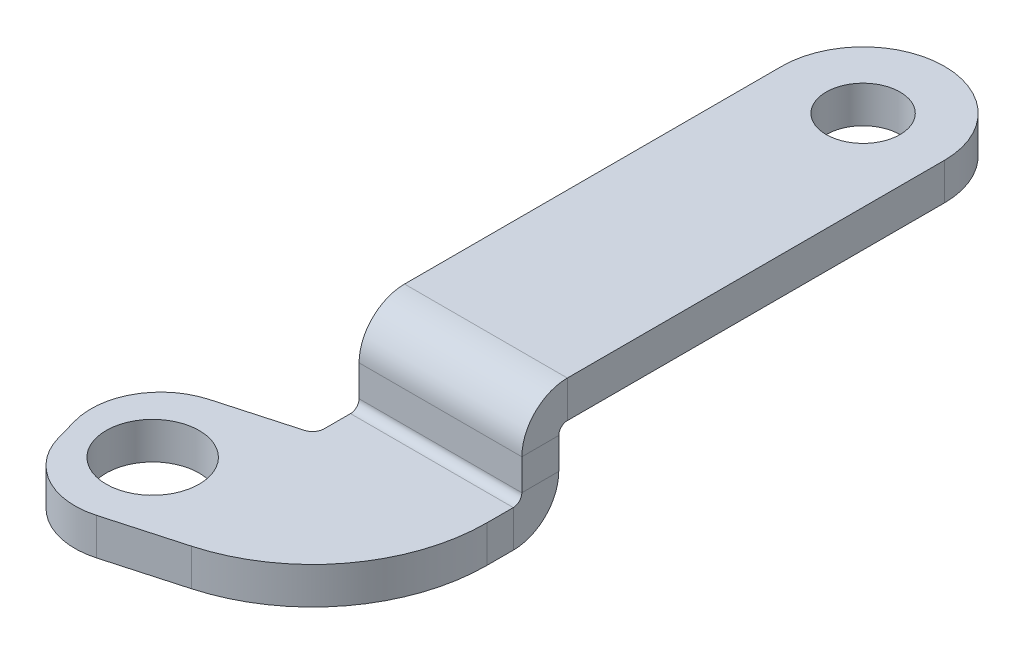
ISO-10303-21;
HEADER;
FILE_DESCRIPTION(('STEP AP214'),'2;1');
FILE_NAME('part.step','',(''),(''),'','','');
FILE_SCHEMA(('AUTOMOTIVE_DESIGN { 1 0 10303 214 1 1 1 1 }'));
ENDSEC;
DATA;
#1=APPLICATION_CONTEXT('core data for automotive mechanical design processes');
#2=APPLICATION_PROTOCOL_DEFINITION('international standard','automotive_design',2000,#1);
#3=PRODUCT_CONTEXT('',#1,'mechanical');
#4=PRODUCT('Part','Part','',(#3));
#5=PRODUCT_RELATED_PRODUCT_CATEGORY('part','',(#4));
#6=PRODUCT_DEFINITION_FORMATION('','',#4);
#7=PRODUCT_DEFINITION_CONTEXT('part definition',#1,'design');
#8=PRODUCT_DEFINITION('design','',#6,#7);
#9=PRODUCT_DEFINITION_SHAPE('','',#8);
#10=(LENGTH_UNIT() NAMED_UNIT(*) SI_UNIT(.MILLI.,.METRE.));
#11=(NAMED_UNIT(*) PLANE_ANGLE_UNIT() SI_UNIT($,.RADIAN.));
#12=(NAMED_UNIT(*) SI_UNIT($,.STERADIAN.) SOLID_ANGLE_UNIT());
#13=UNCERTAINTY_MEASURE_WITH_UNIT(LENGTH_MEASURE(1.E-05),#10,'distance_accuracy_value','');
#14=(GEOMETRIC_REPRESENTATION_CONTEXT(3) GLOBAL_UNCERTAINTY_ASSIGNED_CONTEXT((#13)) GLOBAL_UNIT_ASSIGNED_CONTEXT((#10,
#11,#12)) REPRESENTATION_CONTEXT('',''));
#15=CARTESIAN_POINT('',(0.,0.,0.));
#16=DIRECTION('',(0.,0.,1.));
#17=DIRECTION('',(1.,0.,0.));
#18=AXIS2_PLACEMENT_3D('',#15,#16,#17);
#19=CARTESIAN_POINT('',(0.,7.32499481379612,0.));
#20=DIRECTION('',(0.,-1.,0.));
#21=DIRECTION('',(0.,0.,-1.));
#22=AXIS2_PLACEMENT_3D('',#19,#20,#21);
#23=PLANE('',#22);
#24=DIRECTION('',(0.,0.,-1.));
#25=VECTOR('',#24,1.);
#26=CARTESIAN_POINT('',(19.2500013183316,7.32499481379612,0.));
#27=LINE('',#26,#25);
#28=CARTESIAN_POINT('',(19.2500013183316,7.32499481379612,-16.4116));
#29=VERTEX_POINT('',#28);
#30=CARTESIAN_POINT('',(19.2500013183316,7.32499481379612,-48.8499986312992));
#31=VERTEX_POINT('',#30);
#32=EDGE_CURVE('E261',#29,#31,#27,.T.);
#33=ORIENTED_EDGE('',*,*,#32,.T.);
#34=CARTESIAN_POINT('',(12.2500013183316,7.32499481379612,-48.8499986312992));
#35=DIRECTION('',(0.,1.,0.));
#36=DIRECTION('',(0.,0.,1.));
#37=AXIS2_PLACEMENT_3D('',#34,#35,#36);
#38=CIRCLE('',#37,7.00000000000002);
#39=CARTESIAN_POINT('',(5.25000131833154,7.32499481379612,-48.8499986312992));
#40=VERTEX_POINT('',#39);
#41=EDGE_CURVE('E244',#40,#31,#38,.F.);
#42=ORIENTED_EDGE('',*,*,#41,.F.);
#43=DIRECTION('',(0.,0.,1.));
#44=VECTOR('',#43,1.);
#45=CARTESIAN_POINT('',(5.25000131833154,7.32499481379612,0.));
#46=LINE('',#45,#44);
#47=CARTESIAN_POINT('',(5.25000131833154,7.32499481379612,-16.4116));
#48=VERTEX_POINT('',#47);
#49=EDGE_CURVE('E259',#40,#48,#46,.T.);
#50=ORIENTED_EDGE('',*,*,#49,.T.);
#51=DIRECTION('',(1.,0.,0.));
#52=VECTOR('',#51,1.);
#53=CARTESIAN_POINT('',(5.25000131833154,7.32499481379612,-16.4116));
#54=LINE('',#53,#52);
#55=EDGE_CURVE('E263',#29,#48,#54,.F.);
#56=ORIENTED_EDGE('',*,*,#55,.F.);
#57=EDGE_LOOP('',(#33,#42,#50,#56));
#58=FACE_BOUND('',#57,.T.);
#59=CARTESIAN_POINT('',(12.2500013183316,7.32499481379612,-48.8499986312992));
#60=DIRECTION('',(0.,1.,0.));
#61=DIRECTION('',(0.,0.,1.));
#62=AXIS2_PLACEMENT_3D('',#59,#60,#61);
#63=CIRCLE('',#62,3.175);
#64=CARTESIAN_POINT('',(12.2500013183316,7.32499481379612,-45.6749986312992));
#65=VERTEX_POINT('',#64);
#66=EDGE_CURVE('E794',#65,#65,#63,.T.);
#67=ORIENTED_EDGE('',*,*,#66,.F.);
#68=EDGE_LOOP('',(#67));
#69=FACE_BOUND('',#68,.T.);
#70=ADVANCED_FACE('F105',(#58,#69),#23,.F.);
#71=CARTESIAN_POINT('',(0.,4.14999481379613,0.));
#72=DIRECTION('',(0.,-1.,0.));
#73=DIRECTION('',(0.,0.,-1.));
#74=AXIS2_PLACEMENT_3D('',#71,#72,#73);
#75=PLANE('',#74);
#76=CARTESIAN_POINT('',(12.2500013183316,4.14999481379612,-48.8499986312992));
#77=DIRECTION('',(0.,1.,0.));
#78=DIRECTION('',(0.,0.,1.));
#79=AXIS2_PLACEMENT_3D('',#76,#77,#78);
#80=CIRCLE('',#79,7.00000000000002);
#81=CARTESIAN_POINT('',(5.25000131833154,4.14999481379612,-48.8499986312992));
#82=VERTEX_POINT('',#81);
#83=CARTESIAN_POINT('',(19.2500013183316,4.14999481379612,-48.8499986312992));
#84=VERTEX_POINT('',#83);
#85=EDGE_CURVE('E233',#82,#84,#80,.F.);
#86=ORIENTED_EDGE('',*,*,#85,.T.);
#87=DIRECTION('',(0.,0.,1.));
#88=VECTOR('',#87,1.);
#89=CARTESIAN_POINT('',(19.2500013183316,4.14999481379612,-55.8499986312992));
#90=LINE('',#89,#88);
#91=CARTESIAN_POINT('',(19.2500013183316,4.14999481379612,-16.4116));
#92=VERTEX_POINT('',#91);
#93=EDGE_CURVE('E239',#92,#84,#90,.F.);
#94=ORIENTED_EDGE('',*,*,#93,.F.);
#95=DIRECTION('',(1.,0.,0.));
#96=VECTOR('',#95,1.);
#97=CARTESIAN_POINT('',(5.25000131833154,4.14999481379612,-16.4116));
#98=LINE('',#97,#96);
#99=CARTESIAN_POINT('',(5.25000131833154,4.14999481379612,-16.4116));
#100=VERTEX_POINT('',#99);
#101=EDGE_CURVE('E269',#100,#92,#98,.T.);
#102=ORIENTED_EDGE('',*,*,#101,.F.);
#103=DIRECTION('',(0.,0.,-1.));
#104=VECTOR('',#103,1.);
#105=CARTESIAN_POINT('',(5.25000131833154,4.14999481379612,-15.675));
#106=LINE('',#105,#104);
#107=EDGE_CURVE('E240',#82,#100,#106,.F.);
#108=ORIENTED_EDGE('',*,*,#107,.F.);
#109=EDGE_LOOP('',(#86,#94,#102,#108));
#110=FACE_BOUND('',#109,.T.);
#111=CARTESIAN_POINT('',(12.2500013183316,4.14999481379612,-48.8499986312992));
#112=DIRECTION('',(0.,1.,0.));
#113=DIRECTION('',(0.,0.,1.));
#114=AXIS2_PLACEMENT_3D('',#111,#112,#113);
#115=CIRCLE('',#114,3.175);
#116=CARTESIAN_POINT('',(12.2500013183316,4.14999481379612,-45.6749986312992));
#117=VERTEX_POINT('',#116);
#118=EDGE_CURVE('E253',#117,#117,#115,.T.);
#119=ORIENTED_EDGE('',*,*,#118,.T.);
#120=EDGE_LOOP('',(#119));
#121=FACE_BOUND('',#120,.T.);
#122=ADVANCED_FACE('F235',(#110,#121),#75,.T.);
#123=CARTESIAN_POINT('',(19.2500013183316,7.32499481379612,-55.8499986312992));
#124=DIRECTION('',(-1.,0.,0.));
#125=DIRECTION('',(0.,0.,1.));
#126=AXIS2_PLACEMENT_3D('',#123,#124,#125);
#127=PLANE('',#126);
#128=DIRECTION('',(0.,1.,0.));
#129=VECTOR('',#128,1.);
#130=CARTESIAN_POINT('',(19.2500013183316,4.14999481379612,-48.8499986312992));
#131=LINE('',#130,#129);
#132=EDGE_CURVE('E247',#84,#31,#131,.T.);
#133=ORIENTED_EDGE('',*,*,#132,.T.);
#134=ORIENTED_EDGE('',*,*,#32,.F.);
#135=DIRECTION('',(0.,-1.,0.));
#136=VECTOR('',#135,1.);
#137=CARTESIAN_POINT('',(19.2500013183316,4.14999481379612,-16.4116));
#138=LINE('',#137,#136);
#139=EDGE_CURVE('E258',#92,#29,#138,.F.);
#140=ORIENTED_EDGE('',*,*,#139,.F.);
#141=ORIENTED_EDGE('',*,*,#93,.T.);
#142=EDGE_LOOP('',(#133,#134,#140,#141));
#143=FACE_BOUND('',#142,.T.);
#144=ADVANCED_FACE('F256',(#143),#127,.F.);
#145=CARTESIAN_POINT('',(19.2500013183316,0.,-15.675));
#146=DIRECTION('',(-1.,0.,0.));
#147=DIRECTION('',(0.,0.,1.));
#148=AXIS2_PLACEMENT_3D('',#145,#146,#147);
#149=PLANE('',#148);
#150=DIRECTION('',(0.,0.,1.));
#151=VECTOR('',#150,1.);
#152=CARTESIAN_POINT('',(19.2500013183316,3.41339481379613,-15.675));
#153=LINE('',#152,#151);
#154=CARTESIAN_POINT('',(19.2500013183316,3.41339481379613,-15.675));
#155=VERTEX_POINT('',#154);
#156=CARTESIAN_POINT('',(19.2500013183316,3.41339481379614,-12.5));
#157=VERTEX_POINT('',#156);
#158=EDGE_CURVE('E279',#155,#157,#153,.T.);
#159=ORIENTED_EDGE('',*,*,#158,.T.);
#160=DIRECTION('',(0.,-1.,0.));
#161=VECTOR('',#160,1.);
#162=CARTESIAN_POINT('',(19.2500013183316,0.,-12.5));
#163=LINE('',#162,#161);
#164=CARTESIAN_POINT('',(19.2500013183316,0.736599999999989,-12.5));
#165=VERTEX_POINT('',#164);
#166=EDGE_CURVE('E305',#157,#165,#163,.T.);
#167=ORIENTED_EDGE('',*,*,#166,.T.);
#168=DIRECTION('',(0.,0.,-1.));
#169=VECTOR('',#168,1.);
#170=CARTESIAN_POINT('',(19.2500013183316,0.736599999999997,-12.5));
#171=LINE('',#170,#169);
#172=CARTESIAN_POINT('',(19.2500013183316,0.736599999999978,-15.675));
#173=VERTEX_POINT('',#172);
#174=EDGE_CURVE('E292',#165,#173,#171,.T.);
#175=ORIENTED_EDGE('',*,*,#174,.T.);
#176=DIRECTION('',(0.,-1.,0.));
#177=VECTOR('',#176,1.);
#178=CARTESIAN_POINT('',(19.2500013183316,0.,-15.675));
#179=LINE('',#178,#177);
#180=EDGE_CURVE('E306',#155,#173,#179,.T.);
#181=ORIENTED_EDGE('',*,*,#180,.F.);
#182=EDGE_LOOP('',(#159,#167,#175,#181));
#183=FACE_BOUND('',#182,.T.);
#184=ADVANCED_FACE('F437',(#183),#149,.F.);
#185=CARTESIAN_POINT('',(5.25000131833154,7.32499481379612,-15.675));
#186=DIRECTION('',(1.,0.,0.));
#187=DIRECTION('',(0.,1.,0.));
#188=AXIS2_PLACEMENT_3D('',#185,#186,#187);
#189=PLANE('',#188);
#190=DIRECTION('',(0.,0.,1.));
#191=VECTOR('',#190,1.);
#192=CARTESIAN_POINT('',(5.25000131833154,3.41339481379613,-15.675));
#193=LINE('',#192,#191);
#194=CARTESIAN_POINT('',(5.25000131833154,3.41339481379613,-15.675));
#195=VERTEX_POINT('',#194);
#196=CARTESIAN_POINT('',(5.25000131833154,3.41339481379613,-12.5));
#197=VERTEX_POINT('',#196);
#198=EDGE_CURVE('E290',#195,#197,#193,.T.);
#199=ORIENTED_EDGE('',*,*,#198,.F.);
#200=DIRECTION('',(0.,1.,0.));
#201=VECTOR('',#200,1.);
#202=CARTESIAN_POINT('',(5.25000131833154,7.32499481379612,-15.675));
#203=LINE('',#202,#201);
#204=CARTESIAN_POINT('',(5.25000131833154,0.736600000000019,-15.675));
#205=VERTEX_POINT('',#204);
#206=EDGE_CURVE('E308',#205,#195,#203,.T.);
#207=ORIENTED_EDGE('',*,*,#206,.F.);
#208=DIRECTION('',(0.,0.,-1.));
#209=VECTOR('',#208,1.);
#210=CARTESIAN_POINT('',(5.25000131833154,0.736599999999997,-12.5));
#211=LINE('',#210,#209);
#212=CARTESIAN_POINT('',(5.25000131833154,0.736599999999989,-12.5));
#213=VERTEX_POINT('',#212);
#214=EDGE_CURVE('E297',#213,#205,#211,.T.);
#215=ORIENTED_EDGE('',*,*,#214,.F.);
#216=DIRECTION('',(0.,1.,0.));
#217=VECTOR('',#216,1.);
#218=CARTESIAN_POINT('',(5.25000131833154,7.32499481379613,-12.5));
#219=LINE('',#218,#217);
#220=EDGE_CURVE('E309',#213,#197,#219,.T.);
#221=ORIENTED_EDGE('',*,*,#220,.T.);
#222=EDGE_LOOP('',(#199,#207,#215,#221));
#223=FACE_BOUND('',#222,.T.);
#224=ADVANCED_FACE('F450',(#223),#189,.F.);
#225=CARTESIAN_POINT('',(0.,0.,-15.675));
#226=DIRECTION('',(0.,0.,1.));
#227=DIRECTION('',(0.,-1.,0.));
#228=AXIS2_PLACEMENT_3D('',#225,#226,#227);
#229=PLANE('',#228);
#230=DIRECTION('',(1.,0.,0.));
#231=VECTOR('',#230,1.);
#232=CARTESIAN_POINT('',(19.2500013183316,3.41339481379613,-15.675));
#233=LINE('',#232,#231);
#234=EDGE_CURVE('E285',#155,#195,#233,.F.);
#235=ORIENTED_EDGE('',*,*,#234,.F.);
#236=ORIENTED_EDGE('',*,*,#180,.T.);
#237=DIRECTION('',(1.,0.,0.));
#238=VECTOR('',#237,1.);
#239=CARTESIAN_POINT('',(0.,0.736600000000019,-15.675));
#240=LINE('',#239,#238);
#241=EDGE_CURVE('E300',#205,#173,#240,.T.);
#242=ORIENTED_EDGE('',*,*,#241,.F.);
#243=ORIENTED_EDGE('',*,*,#206,.T.);
#244=EDGE_LOOP('',(#235,#236,#242,#243));
#245=FACE_BOUND('',#244,.T.);
#246=ADVANCED_FACE('F453',(#245),#229,.F.);
#247=CARTESIAN_POINT('',(0.,0.,-12.5));
#248=DIRECTION('',(0.,0.,1.));
#249=DIRECTION('',(0.,-1.,0.));
#250=AXIS2_PLACEMENT_3D('',#247,#248,#249);
#251=PLANE('',#250);
#252=ORIENTED_EDGE('',*,*,#166,.F.);
#253=DIRECTION('',(1.,0.,0.));
#254=VECTOR('',#253,1.);
#255=CARTESIAN_POINT('',(19.2500013183316,3.41339481379614,-12.5));
#256=LINE('',#255,#254);
#257=EDGE_CURVE('E274',#157,#197,#256,.F.);
#258=ORIENTED_EDGE('',*,*,#257,.T.);
#259=ORIENTED_EDGE('',*,*,#220,.F.);
#260=DIRECTION('',(-1.,0.,0.));
#261=VECTOR('',#260,1.);
#262=CARTESIAN_POINT('',(19.2500013183316,0.736599999999997,-12.5));
#263=LINE('',#262,#261);
#264=EDGE_CURVE('E295',#165,#213,#263,.T.);
#265=ORIENTED_EDGE('',*,*,#264,.F.);
#266=EDGE_LOOP('',(#252,#258,#259,#265));
#267=FACE_BOUND('',#266,.T.);
#268=ADVANCED_FACE('F440',(#267),#251,.T.);
#269=CARTESIAN_POINT('',(5.25000131833154,-3.175,-9.5));
#270=DIRECTION('',(-1.,0.,0.));
#271=DIRECTION('',(0.,0.,1.));
#272=AXIS2_PLACEMENT_3D('',#269,#270,#271);
#273=PLANE('',#272);
#274=DIRECTION('',(0.,0.,1.));
#275=VECTOR('',#274,1.);
#276=CARTESIAN_POINT('',(5.25000131833154,0.,-9.5));
#277=LINE('',#276,#275);
#278=CARTESIAN_POINT('',(5.25000131833154,0.,-11.7634));
#279=VERTEX_POINT('',#278);
#280=CARTESIAN_POINT('',(5.25000131833154,0.,-9.5));
#281=VERTEX_POINT('',#280);
#282=EDGE_CURVE('E380',#279,#281,#277,.T.);
#283=ORIENTED_EDGE('',*,*,#282,.F.);
#284=DIRECTION('',(0.,-1.,0.));
#285=VECTOR('',#284,1.);
#286=CARTESIAN_POINT('',(5.25000131833154,0.,-11.7634));
#287=LINE('',#286,#285);
#288=CARTESIAN_POINT('',(5.25000131833154,-3.17500000000001,-11.7634));
#289=VERTEX_POINT('',#288);
#290=EDGE_CURVE('E322',#279,#289,#287,.T.);
#291=ORIENTED_EDGE('',*,*,#290,.T.);
#292=DIRECTION('',(0.,0.,1.));
#293=VECTOR('',#292,1.);
#294=CARTESIAN_POINT('',(5.25000131833154,-3.175,-9.5));
#295=LINE('',#294,#293);
#296=CARTESIAN_POINT('',(5.25000131833154,-3.175,-9.5));
#297=VERTEX_POINT('',#296);
#298=EDGE_CURVE('E356',#289,#297,#295,.T.);
#299=ORIENTED_EDGE('',*,*,#298,.T.);
#300=DIRECTION('',(0.,1.,0.));
#301=VECTOR('',#300,1.);
#302=CARTESIAN_POINT('',(5.25000131833154,-3.175,-9.5));
#303=LINE('',#302,#301);
#304=EDGE_CURVE('E398',#297,#281,#303,.T.);
#305=ORIENTED_EDGE('',*,*,#304,.T.);
#306=EDGE_LOOP('',(#283,#291,#299,#305));
#307=FACE_BOUND('',#306,.T.);
#308=ADVANCED_FACE('F509',(#307),#273,.T.);
#309=CARTESIAN_POINT('',(0.26995265979346,-3.175,0.962873595790457));
#310=DIRECTION('',(0.,1.,0.));
#311=DIRECTION('',(0.,0.,1.));
#312=AXIS2_PLACEMENT_3D('',#309,#310,#311);
#313=PLANE('',#312);
#314=CARTESIAN_POINT('',(0.,-3.175,0.));
#315=DIRECTION('',(0.,1.,0.));
#316=DIRECTION('',(0.,0.,1.));
#317=AXIS2_PLACEMENT_3D('',#314,#315,#316);
#318=CIRCLE('',#317,4.);
#319=CARTESIAN_POINT('',(0.,-3.175,4.));
#320=VERTEX_POINT('',#319);
#321=EDGE_CURVE('E337',#320,#320,#318,.T.);
#322=ORIENTED_EDGE('',*,*,#321,.T.);
#323=EDGE_LOOP('',(#322));
#324=FACE_BOUND('',#323,.T.);
#325=DIRECTION('',(-1.,0.,0.));
#326=VECTOR('',#325,1.);
#327=CARTESIAN_POINT('',(5.25000131833154,-3.17500000000001,-11.7634));
#328=LINE('',#327,#326);
#329=CARTESIAN_POINT('',(19.2500013183316,-3.175,-11.7634));
#330=VERTEX_POINT('',#329);
#331=EDGE_CURVE('E316',#289,#330,#328,.F.);
#332=ORIENTED_EDGE('',*,*,#331,.T.);
#333=DIRECTION('',(0.,0.,-1.));
#334=VECTOR('',#333,1.);
#335=CARTESIAN_POINT('',(19.2500013183315,-3.175,-9.5));
#336=LINE('',#335,#334);
#337=CARTESIAN_POINT('',(19.2500013183315,-3.175,-9.5));
#338=VERTEX_POINT('',#337);
#339=EDGE_CURVE('E353',#338,#330,#336,.T.);
#340=ORIENTED_EDGE('',*,*,#339,.F.);
#341=CARTESIAN_POINT('',(4.25000131833154,-3.175,-9.5));
#342=DIRECTION('',(0.,1.,0.));
#343=DIRECTION('',(0.,0.,1.));
#344=AXIS2_PLACEMENT_3D('',#341,#342,#343);
#345=CIRCLE('',#344,15.);
#346=CARTESIAN_POINT('',(8.29929121523342,-3.175,4.9431039368568));
#347=VERTEX_POINT('',#346);
#348=EDGE_CURVE('E350',#347,#338,#345,.T.);
#349=ORIENTED_EDGE('',*,*,#348,.F.);
#350=DIRECTION('',(0.962873595790453,0.,-0.269952659793459));
#351=VECTOR('',#350,1.);
#352=CARTESIAN_POINT('',(1.88966861855421,-3.175,6.74011517053317));
#353=LINE('',#352,#351);
#354=CARTESIAN_POINT('',(1.88966861855421,-3.175,6.74011517053317));
#355=VERTEX_POINT('',#354);
#356=EDGE_CURVE('E346',#355,#347,#353,.T.);
#357=ORIENTED_EDGE('',*,*,#356,.F.);
#358=CARTESIAN_POINT('',(0.26995265979346,-3.175,0.962873595790457));
#359=DIRECTION('',(0.,1.,0.));
#360=DIRECTION('',(0.,0.,1.));
#361=AXIS2_PLACEMENT_3D('',#358,#359,#360);
#362=CIRCLE('',#361,6.);
#363=CARTESIAN_POINT('',(-5.50728891494926,-3.175,2.58258955455121));
#364=VERTEX_POINT('',#363);
#365=EDGE_CURVE('E343',#364,#355,#362,.T.);
#366=ORIENTED_EDGE('',*,*,#365,.F.);
#367=DIRECTION('',(0.269952659793459,0.,0.962873595790453));
#368=VECTOR('',#367,1.);
#369=CARTESIAN_POINT('',(-5.50728891494926,-3.175,2.58258955455121));
#370=LINE('',#369,#368);
#371=CARTESIAN_POINT('',(-6.04719423453618,-3.175,0.656842362970299));
#372=VERTEX_POINT('',#371);
#373=EDGE_CURVE('E367',#372,#364,#370,.T.);
#374=ORIENTED_EDGE('',*,*,#373,.F.);
#375=CARTESIAN_POINT('',(-0.26995265979346,-3.175,-0.962873595790456));
#376=DIRECTION('',(0.,1.,0.));
#377=DIRECTION('',(0.,0.,-1.));
#378=AXIS2_PLACEMENT_3D('',#375,#376,#377);
#379=CIRCLE('',#378,6.);
#380=CARTESIAN_POINT('',(-1.88966861855421,-3.175,-6.74011517053317));
#381=VERTEX_POINT('',#380);
#382=EDGE_CURVE('E364',#381,#372,#379,.T.);
#383=ORIENTED_EDGE('',*,*,#382,.F.);
#384=DIRECTION('',(-0.962873595790453,0.,0.26995265979346));
#385=VECTOR('',#384,1.);
#386=CARTESIAN_POINT('',(-1.88966861855421,-3.175,-6.74011517053317));
#387=LINE('',#386,#385);
#388=CARTESIAN_POINT('',(4.519953978125,-3.175,-8.53712640420955));
#389=VERTEX_POINT('',#388);
#390=EDGE_CURVE('E361',#389,#381,#387,.T.);
#391=ORIENTED_EDGE('',*,*,#390,.F.);
#392=CARTESIAN_POINT('',(4.25000131833154,-3.175,-9.5));
#393=DIRECTION('',(0.,-1.,0.));
#394=DIRECTION('',(0.,0.,1.));
#395=AXIS2_PLACEMENT_3D('',#392,#393,#394);
#396=CIRCLE('',#395,1.);
#397=EDGE_CURVE('E358',#297,#389,#396,.T.);
#398=ORIENTED_EDGE('',*,*,#397,.F.);
#399=ORIENTED_EDGE('',*,*,#298,.F.);
#400=EDGE_LOOP('',(#332,#340,#349,#357,#366,#374,#383,#391,#398,#399));
#401=FACE_BOUND('',#400,.T.);
#402=ADVANCED_FACE('F418',(#324,#401),#313,.F.);
#403=CARTESIAN_POINT('',(0.26995265979346,0.,0.962873595790457));
#404=DIRECTION('',(0.,1.,0.));
#405=DIRECTION('',(0.,0.,1.));
#406=AXIS2_PLACEMENT_3D('',#403,#404,#405);
#407=PLANE('',#406);
#408=CARTESIAN_POINT('',(0.,0.,0.));
#409=DIRECTION('',(0.,1.,0.));
#410=DIRECTION('',(0.,0.,1.));
#411=AXIS2_PLACEMENT_3D('',#408,#409,#410);
#412=CIRCLE('',#411,4.);
#413=CARTESIAN_POINT('',(0.,0.,4.));
#414=VERTEX_POINT('',#413);
#415=EDGE_CURVE('E334',#414,#414,#412,.T.);
#416=ORIENTED_EDGE('',*,*,#415,.F.);
#417=EDGE_LOOP('',(#416));
#418=FACE_BOUND('',#417,.T.);
#419=DIRECTION('',(0.,0.,-1.));
#420=VECTOR('',#419,1.);
#421=CARTESIAN_POINT('',(19.2500013183315,0.,-9.5));
#422=LINE('',#421,#420);
#423=CARTESIAN_POINT('',(19.2500013183315,0.,-9.5));
#424=VERTEX_POINT('',#423);
#425=CARTESIAN_POINT('',(19.2500013183316,0.,-11.7634));
#426=VERTEX_POINT('',#425);
#427=EDGE_CURVE('E378',#424,#426,#422,.T.);
#428=ORIENTED_EDGE('',*,*,#427,.T.);
#429=DIRECTION('',(-1.,0.,0.));
#430=VECTOR('',#429,1.);
#431=CARTESIAN_POINT('',(5.25000131833154,0.,-11.7634));
#432=LINE('',#431,#430);
#433=EDGE_CURVE('E130',#279,#426,#432,.F.);
#434=ORIENTED_EDGE('',*,*,#433,.F.);
#435=ORIENTED_EDGE('',*,*,#282,.T.);
#436=CARTESIAN_POINT('',(4.25000131833154,0.,-9.5));
#437=DIRECTION('',(0.,-1.,0.));
#438=DIRECTION('',(0.,0.,1.));
#439=AXIS2_PLACEMENT_3D('',#436,#437,#438);
#440=CIRCLE('',#439,1.);
#441=CARTESIAN_POINT('',(4.519953978125,0.,-8.53712640420955));
#442=VERTEX_POINT('',#441);
#443=EDGE_CURVE('E382',#281,#442,#440,.T.);
#444=ORIENTED_EDGE('',*,*,#443,.T.);
#445=DIRECTION('',(-0.962873595790453,0.,0.26995265979346));
#446=VECTOR('',#445,1.);
#447=CARTESIAN_POINT('',(-1.88966861855421,0.,-6.74011517053317));
#448=LINE('',#447,#446);
#449=CARTESIAN_POINT('',(-1.88966861855421,0.,-6.74011517053317));
#450=VERTEX_POINT('',#449);
#451=EDGE_CURVE('E385',#442,#450,#448,.T.);
#452=ORIENTED_EDGE('',*,*,#451,.T.);
#453=CARTESIAN_POINT('',(-0.26995265979346,0.,-0.962873595790456));
#454=DIRECTION('',(0.,1.,0.));
#455=DIRECTION('',(0.,0.,-1.));
#456=AXIS2_PLACEMENT_3D('',#453,#454,#455);
#457=CIRCLE('',#456,6.);
#458=CARTESIAN_POINT('',(-6.04719423453618,0.,0.656842362970299));
#459=VERTEX_POINT('',#458);
#460=EDGE_CURVE('E388',#450,#459,#457,.T.);
#461=ORIENTED_EDGE('',*,*,#460,.T.);
#462=DIRECTION('',(0.269952659793459,0.,0.962873595790453));
#463=VECTOR('',#462,1.);
#464=CARTESIAN_POINT('',(-5.50728891494926,0.,2.58258955455121));
#465=LINE('',#464,#463);
#466=CARTESIAN_POINT('',(-5.50728891494926,0.,2.58258955455121));
#467=VERTEX_POINT('',#466);
#468=EDGE_CURVE('E347',#459,#467,#465,.T.);
#469=ORIENTED_EDGE('',*,*,#468,.T.);
#470=CARTESIAN_POINT('',(0.26995265979346,0.,0.962873595790457));
#471=DIRECTION('',(0.,1.,0.));
#472=DIRECTION('',(0.,0.,1.));
#473=AXIS2_PLACEMENT_3D('',#470,#471,#472);
#474=CIRCLE('',#473,6.);
#475=CARTESIAN_POINT('',(1.88966861855421,0.,6.74011517053317));
#476=VERTEX_POINT('',#475);
#477=EDGE_CURVE('E340',#467,#476,#474,.T.);
#478=ORIENTED_EDGE('',*,*,#477,.T.);
#479=DIRECTION('',(0.962873595790453,0.,-0.269952659793459));
#480=VECTOR('',#479,1.);
#481=CARTESIAN_POINT('',(1.88966861855421,0.,6.74011517053317));
#482=LINE('',#481,#480);
#483=CARTESIAN_POINT('',(8.29929121523342,0.,4.9431039368568));
#484=VERTEX_POINT('',#483);
#485=EDGE_CURVE('E372',#476,#484,#482,.T.);
#486=ORIENTED_EDGE('',*,*,#485,.T.);
#487=CARTESIAN_POINT('',(4.25000131833154,0.,-9.5));
#488=DIRECTION('',(0.,1.,0.));
#489=DIRECTION('',(0.,0.,1.));
#490=AXIS2_PLACEMENT_3D('',#487,#488,#489);
#491=CIRCLE('',#490,15.);
#492=EDGE_CURVE('E375',#484,#424,#491,.T.);
#493=ORIENTED_EDGE('',*,*,#492,.T.);
#494=EDGE_LOOP('',(#428,#434,#435,#444,#452,#461,#469,#478,#486,#493));
#495=FACE_BOUND('',#494,.T.);
#496=ADVANCED_FACE('F411',(#418,#495),#407,.T.);
#497=CARTESIAN_POINT('',(0.26995265979346,-3.175,0.962873595790457));
#498=DIRECTION('',(0.,1.,0.));
#499=DIRECTION('',(0.,0.,1.));
#500=AXIS2_PLACEMENT_3D('',#497,#498,#499);
#501=CYLINDRICAL_SURFACE('',#500,6.);
#502=ORIENTED_EDGE('',*,*,#477,.F.);
#503=DIRECTION('',(0.,1.,0.));
#504=VECTOR('',#503,1.);
#505=CARTESIAN_POINT('',(-5.50728891494926,-3.175,2.58258955455121));
#506=LINE('',#505,#504);
#507=EDGE_CURVE('E13',#364,#467,#506,.T.);
#508=ORIENTED_EDGE('',*,*,#507,.F.);
#509=ORIENTED_EDGE('',*,*,#365,.T.);
#510=DIRECTION('',(0.,1.,0.));
#511=VECTOR('',#510,1.);
#512=CARTESIAN_POINT('',(1.88966861855421,-3.175,6.74011517053317));
#513=LINE('',#512,#511);
#514=EDGE_CURVE('E109',#355,#476,#513,.T.);
#515=ORIENTED_EDGE('',*,*,#514,.T.);
#516=EDGE_LOOP('',(#502,#508,#509,#515));
#517=FACE_BOUND('',#516,.T.);
#518=ADVANCED_FACE('F107',(#517),#501,.T.);
#519=CARTESIAN_POINT('',(-5.50728891494926,-3.175,2.58258955455121));
#520=DIRECTION('',(-0.962873595790453,0.,0.269952659793459));
#521=DIRECTION('',(0.269952659793459,0.,0.962873595790453));
#522=AXIS2_PLACEMENT_3D('',#519,#520,#521);
#523=PLANE('',#522);
#524=ORIENTED_EDGE('',*,*,#468,.F.);
#525=DIRECTION('',(0.,1.,0.));
#526=VECTOR('',#525,1.);
#527=CARTESIAN_POINT('',(-6.04719423453618,-3.175,0.656842362970299));
#528=LINE('',#527,#526);
#529=EDGE_CURVE('E114',#372,#459,#528,.T.);
#530=ORIENTED_EDGE('',*,*,#529,.F.);
#531=ORIENTED_EDGE('',*,*,#373,.T.);
#532=ORIENTED_EDGE('',*,*,#507,.T.);
#533=EDGE_LOOP('',(#524,#530,#531,#532));
#534=FACE_BOUND('',#533,.T.);
#535=ADVANCED_FACE('F415',(#534),#523,.T.);
#536=CARTESIAN_POINT('',(-0.26995265979346,-3.175,-0.962873595790456));
#537=DIRECTION('',(0.,1.,0.));
#538=DIRECTION('',(0.,0.,1.));
#539=AXIS2_PLACEMENT_3D('',#536,#537,#538);
#540=CYLINDRICAL_SURFACE('',#539,6.);
#541=ORIENTED_EDGE('',*,*,#460,.F.);
#542=DIRECTION('',(0.,1.,0.));
#543=VECTOR('',#542,1.);
#544=CARTESIAN_POINT('',(-1.88966861855421,-3.175,-6.74011517053317));
#545=LINE('',#544,#543);
#546=EDGE_CURVE('E394',#381,#450,#545,.T.);
#547=ORIENTED_EDGE('',*,*,#546,.F.);
#548=ORIENTED_EDGE('',*,*,#382,.T.);
#549=ORIENTED_EDGE('',*,*,#529,.T.);
#550=EDGE_LOOP('',(#541,#547,#548,#549));
#551=FACE_BOUND('',#550,.T.);
#552=ADVANCED_FACE('F532',(#551),#540,.T.);
#553=CARTESIAN_POINT('',(-1.88966861855421,-3.175,-6.74011517053317));
#554=DIRECTION('',(-0.26995265979346,0.,-0.962873595790453));
#555=DIRECTION('',(-0.962873595790453,0.,0.26995265979346));
#556=AXIS2_PLACEMENT_3D('',#553,#554,#555);
#557=PLANE('',#556);
#558=ORIENTED_EDGE('',*,*,#451,.F.);
#559=DIRECTION('',(0.,1.,0.));
#560=VECTOR('',#559,1.);
#561=CARTESIAN_POINT('',(4.519953978125,-3.175,-8.53712640420955));
#562=LINE('',#561,#560);
#563=EDGE_CURVE('E396',#389,#442,#562,.T.);
#564=ORIENTED_EDGE('',*,*,#563,.F.);
#565=ORIENTED_EDGE('',*,*,#390,.T.);
#566=ORIENTED_EDGE('',*,*,#546,.T.);
#567=EDGE_LOOP('',(#558,#564,#565,#566));
#568=FACE_BOUND('',#567,.T.);
#569=ADVANCED_FACE('F469',(#568),#557,.T.);
#570=CARTESIAN_POINT('',(4.25000131833154,-3.175,-9.5));
#571=DIRECTION('',(0.,1.,0.));
#572=DIRECTION('',(0.,0.,1.));
#573=AXIS2_PLACEMENT_3D('',#570,#571,#572);
#574=CYLINDRICAL_SURFACE('',#573,1.);
#575=ORIENTED_EDGE('',*,*,#443,.F.);
#576=ORIENTED_EDGE('',*,*,#304,.F.);
#577=ORIENTED_EDGE('',*,*,#397,.T.);
#578=ORIENTED_EDGE('',*,*,#563,.T.);
#579=EDGE_LOOP('',(#575,#576,#577,#578));
#580=FACE_BOUND('',#579,.T.);
#581=ADVANCED_FACE('F460',(#580),#574,.F.);
#582=CARTESIAN_POINT('',(19.2500013183315,-3.175,-9.5));
#583=DIRECTION('',(1.,0.,0.));
#584=DIRECTION('',(0.,0.,-1.));
#585=AXIS2_PLACEMENT_3D('',#582,#583,#584);
#586=PLANE('',#585);
#587=DIRECTION('',(0.,-1.,0.));
#588=VECTOR('',#587,1.);
#589=CARTESIAN_POINT('',(19.2500013183316,0.,-11.7634));
#590=LINE('',#589,#588);
#591=EDGE_CURVE('E331',#426,#330,#590,.T.);
#592=ORIENTED_EDGE('',*,*,#591,.F.);
#593=ORIENTED_EDGE('',*,*,#427,.F.);
#594=DIRECTION('',(0.,1.,0.));
#595=VECTOR('',#594,1.);
#596=CARTESIAN_POINT('',(19.2500013183315,-3.175,-9.5));
#597=LINE('',#596,#595);
#598=EDGE_CURVE('E401',#338,#424,#597,.T.);
#599=ORIENTED_EDGE('',*,*,#598,.F.);
#600=ORIENTED_EDGE('',*,*,#339,.T.);
#601=EDGE_LOOP('',(#592,#593,#599,#600));
#602=FACE_BOUND('',#601,.T.);
#603=ADVANCED_FACE('F458',(#602),#586,.T.);
#604=CARTESIAN_POINT('',(4.25000131833154,-3.175,-9.5));
#605=DIRECTION('',(0.,1.,0.));
#606=DIRECTION('',(0.,0.,1.));
#607=AXIS2_PLACEMENT_3D('',#604,#605,#606);
#608=CYLINDRICAL_SURFACE('',#607,15.);
#609=ORIENTED_EDGE('',*,*,#492,.F.);
#610=DIRECTION('',(0.,1.,0.));
#611=VECTOR('',#610,1.);
#612=CARTESIAN_POINT('',(8.29929121523342,-3.175,4.9431039368568));
#613=LINE('',#612,#611);
#614=EDGE_CURVE('E402',#347,#484,#613,.T.);
#615=ORIENTED_EDGE('',*,*,#614,.F.);
#616=ORIENTED_EDGE('',*,*,#348,.T.);
#617=ORIENTED_EDGE('',*,*,#598,.T.);
#618=EDGE_LOOP('',(#609,#615,#616,#617));
#619=FACE_BOUND('',#618,.T.);
#620=ADVANCED_FACE('F423',(#619),#608,.T.);
#621=CARTESIAN_POINT('',(1.88966861855421,-3.175,6.74011517053317));
#622=DIRECTION('',(0.269952659793459,0.,0.962873595790453));
#623=DIRECTION('',(0.962873595790453,0.,-0.269952659793459));
#624=AXIS2_PLACEMENT_3D('',#621,#622,#623);
#625=PLANE('',#624);
#626=ORIENTED_EDGE('',*,*,#485,.F.);
#627=ORIENTED_EDGE('',*,*,#514,.F.);
#628=ORIENTED_EDGE('',*,*,#356,.T.);
#629=ORIENTED_EDGE('',*,*,#614,.T.);
#630=EDGE_LOOP('',(#626,#627,#628,#629));
#631=FACE_BOUND('',#630,.T.);
#632=ADVANCED_FACE('F410',(#631),#625,.T.);
#633=CARTESIAN_POINT('',(0.,-3.175,0.));
#634=DIRECTION('',(0.,1.,0.));
#635=DIRECTION('',(0.,0.,1.));
#636=AXIS2_PLACEMENT_3D('',#633,#634,#635);
#637=CYLINDRICAL_SURFACE('',#636,4.);
#638=ORIENTED_EDGE('',*,*,#321,.F.);
#639=EDGE_LOOP('',(#638));
#640=FACE_BOUND('',#639,.T.);
#641=ORIENTED_EDGE('',*,*,#415,.T.);
#642=EDGE_LOOP('',(#641));
#643=FACE_BOUND('',#642,.T.);
#644=ADVANCED_FACE('F519',(#640,#643),#637,.F.);
#645=CARTESIAN_POINT('',(19.2500013183316,0.736599999999992,-11.7634));
#646=DIRECTION('',(1.,0.,0.));
#647=DIRECTION('',(0.,0.,-1.));
#648=AXIS2_PLACEMENT_3D('',#645,#646,#647);
#649=PLANE('',#648);
#650=ORIENTED_EDGE('',*,*,#174,.F.);
#651=CARTESIAN_POINT('',(19.2500013183316,0.736599999999992,-11.7634));
#652=DIRECTION('',(-1.,0.,0.));
#653=DIRECTION('',(0.,0.,1.));
#654=AXIS2_PLACEMENT_3D('',#651,#652,#653);
#655=CIRCLE('',#654,0.7366);
#656=EDGE_CURVE('E325',#426,#165,#655,.F.);
#657=ORIENTED_EDGE('',*,*,#656,.F.);
#658=ORIENTED_EDGE('',*,*,#591,.T.);
#659=CARTESIAN_POINT('',(19.2500013183316,0.736599999999992,-11.7634));
#660=DIRECTION('',(-1.,0.,0.));
#661=DIRECTION('',(0.,0.,1.));
#662=AXIS2_PLACEMENT_3D('',#659,#660,#661);
#663=CIRCLE('',#662,3.9116);
#664=EDGE_CURVE('E318',#330,#173,#663,.F.);
#665=ORIENTED_EDGE('',*,*,#664,.T.);
#666=EDGE_LOOP('',(#650,#657,#658,#665));
#667=FACE_BOUND('',#666,.T.);
#668=ADVANCED_FACE('F433',(#667),#649,.T.);
#669=CARTESIAN_POINT('',(5.25000131833154,0.736599999999992,-11.7634));
#670=DIRECTION('',(1.,0.,0.));
#671=DIRECTION('',(0.,0.,-1.));
#672=AXIS2_PLACEMENT_3D('',#669,#670,#671);
#673=PLANE('',#672);
#674=CARTESIAN_POINT('',(5.25000131833154,0.736599999999992,-11.7634));
#675=DIRECTION('',(-1.,0.,0.));
#676=DIRECTION('',(0.,0.,1.));
#677=AXIS2_PLACEMENT_3D('',#674,#675,#676);
#678=CIRCLE('',#677,0.7366);
#679=EDGE_CURVE('E312',#213,#279,#678,.T.);
#680=ORIENTED_EDGE('',*,*,#679,.F.);
#681=ORIENTED_EDGE('',*,*,#214,.T.);
#682=CARTESIAN_POINT('',(5.25000131833154,0.736599999999992,-11.7634));
#683=DIRECTION('',(-1.,0.,0.));
#684=DIRECTION('',(0.,0.,1.));
#685=AXIS2_PLACEMENT_3D('',#682,#683,#684);
#686=CIRCLE('',#685,3.9116);
#687=EDGE_CURVE('E319',#205,#289,#686,.T.);
#688=ORIENTED_EDGE('',*,*,#687,.T.);
#689=ORIENTED_EDGE('',*,*,#290,.F.);
#690=EDGE_LOOP('',(#680,#681,#688,#689));
#691=FACE_BOUND('',#690,.T.);
#692=ADVANCED_FACE('F445',(#691),#673,.F.);
#693=CARTESIAN_POINT('',(5.25000131833154,0.736599999999992,-11.7634));
#694=DIRECTION('',(-1.,0.,0.));
#695=DIRECTION('',(0.,0.,-1.));
#696=AXIS2_PLACEMENT_3D('',#693,#694,#695);
#697=CYLINDRICAL_SURFACE('',#696,3.9116);
#698=ORIENTED_EDGE('',*,*,#331,.F.);
#699=ORIENTED_EDGE('',*,*,#687,.F.);
#700=ORIENTED_EDGE('',*,*,#241,.T.);
#701=ORIENTED_EDGE('',*,*,#664,.F.);
#702=EDGE_LOOP('',(#698,#699,#700,#701));
#703=FACE_BOUND('',#702,.T.);
#704=ADVANCED_FACE('F456',(#703),#697,.T.);
#705=CARTESIAN_POINT('',(5.25000131833154,0.736599999999992,-11.7634));
#706=DIRECTION('',(-1.,0.,0.));
#707=DIRECTION('',(0.,0.,-1.));
#708=AXIS2_PLACEMENT_3D('',#705,#706,#707);
#709=CYLINDRICAL_SURFACE('',#708,0.7366);
#710=ORIENTED_EDGE('',*,*,#433,.T.);
#711=ORIENTED_EDGE('',*,*,#656,.T.);
#712=ORIENTED_EDGE('',*,*,#264,.T.);
#713=ORIENTED_EDGE('',*,*,#679,.T.);
#714=EDGE_LOOP('',(#710,#711,#712,#713));
#715=FACE_BOUND('',#714,.T.);
#716=ADVANCED_FACE('F428',(#715),#709,.F.);
#717=CARTESIAN_POINT('',(5.25000131833154,3.41339481379612,-16.4116));
#718=DIRECTION('',(-1.,0.,0.));
#719=DIRECTION('',(0.,0.,1.));
#720=AXIS2_PLACEMENT_3D('',#717,#718,#719);
#721=PLANE('',#720);
#722=DIRECTION('',(0.,-1.,0.));
#723=VECTOR('',#722,1.);
#724=CARTESIAN_POINT('',(5.25000131833154,7.32499481379612,-16.4116));
#725=LINE('',#724,#723);
#726=EDGE_CURVE('E271',#100,#48,#725,.F.);
#727=ORIENTED_EDGE('',*,*,#726,.F.);
#728=CARTESIAN_POINT('',(5.25000131833154,3.41339481379612,-16.4116));
#729=DIRECTION('',(1.,0.,0.));
#730=DIRECTION('',(0.,0.,-1.));
#731=AXIS2_PLACEMENT_3D('',#728,#729,#730);
#732=CIRCLE('',#731,0.7366);
#733=EDGE_CURVE('E282',#195,#100,#732,.F.);
#734=ORIENTED_EDGE('',*,*,#733,.F.);
#735=ORIENTED_EDGE('',*,*,#198,.T.);
#736=CARTESIAN_POINT('',(5.25000131833154,3.41339481379612,-16.4116));
#737=DIRECTION('',(1.,0.,0.));
#738=DIRECTION('',(0.,0.,-1.));
#739=AXIS2_PLACEMENT_3D('',#736,#737,#738);
#740=CIRCLE('',#739,3.9116);
#741=EDGE_CURVE('E122',#197,#48,#740,.F.);
#742=ORIENTED_EDGE('',*,*,#741,.T.);
#743=EDGE_LOOP('',(#727,#734,#735,#742));
#744=FACE_BOUND('',#743,.T.);
#745=ADVANCED_FACE('F498',(#744),#721,.T.);
#746=CARTESIAN_POINT('',(19.2500013183316,3.41339481379612,-16.4116));
#747=DIRECTION('',(-1.,0.,0.));
#748=DIRECTION('',(0.,0.,1.));
#749=AXIS2_PLACEMENT_3D('',#746,#747,#748);
#750=PLANE('',#749);
#751=CARTESIAN_POINT('',(19.2500013183316,3.41339481379612,-16.4116));
#752=DIRECTION('',(1.,0.,0.));
#753=DIRECTION('',(0.,0.,-1.));
#754=AXIS2_PLACEMENT_3D('',#751,#752,#753);
#755=CIRCLE('',#754,0.7366);
#756=EDGE_CURVE('E287',#92,#155,#755,.T.);
#757=ORIENTED_EDGE('',*,*,#756,.F.);
#758=ORIENTED_EDGE('',*,*,#139,.T.);
#759=CARTESIAN_POINT('',(19.2500013183316,3.41339481379612,-16.4116));
#760=DIRECTION('',(1.,0.,0.));
#761=DIRECTION('',(0.,0.,-1.));
#762=AXIS2_PLACEMENT_3D('',#759,#760,#761);
#763=CIRCLE('',#762,3.9116);
#764=EDGE_CURVE('E277',#29,#157,#763,.T.);
#765=ORIENTED_EDGE('',*,*,#764,.T.);
#766=ORIENTED_EDGE('',*,*,#158,.F.);
#767=EDGE_LOOP('',(#757,#758,#765,#766));
#768=FACE_BOUND('',#767,.T.);
#769=ADVANCED_FACE('F495',(#768),#750,.F.);
#770=CARTESIAN_POINT('',(19.2500013183316,3.41339481379612,-16.4116));
#771=DIRECTION('',(1.,0.,0.));
#772=DIRECTION('',(0.,1.,0.));
#773=AXIS2_PLACEMENT_3D('',#770,#771,#772);
#774=CYLINDRICAL_SURFACE('',#773,3.9116);
#775=ORIENTED_EDGE('',*,*,#257,.F.);
#776=ORIENTED_EDGE('',*,*,#764,.F.);
#777=ORIENTED_EDGE('',*,*,#55,.T.);
#778=ORIENTED_EDGE('',*,*,#741,.F.);
#779=EDGE_LOOP('',(#775,#776,#777,#778));
#780=FACE_BOUND('',#779,.T.);
#781=ADVANCED_FACE('F492',(#780),#774,.T.);
#782=CARTESIAN_POINT('',(19.2500013183316,3.41339481379612,-16.4116));
#783=DIRECTION('',(1.,0.,0.));
#784=DIRECTION('',(0.,1.,0.));
#785=AXIS2_PLACEMENT_3D('',#782,#783,#784);
#786=CYLINDRICAL_SURFACE('',#785,0.7366);
#787=ORIENTED_EDGE('',*,*,#234,.T.);
#788=ORIENTED_EDGE('',*,*,#733,.T.);
#789=ORIENTED_EDGE('',*,*,#101,.T.);
#790=ORIENTED_EDGE('',*,*,#756,.T.);
#791=EDGE_LOOP('',(#787,#788,#789,#790));
#792=FACE_BOUND('',#791,.T.);
#793=ADVANCED_FACE('F490',(#792),#786,.F.);
#794=CARTESIAN_POINT('',(5.25000131833154,7.32499481379612,-15.675));
#795=DIRECTION('',(1.,0.,0.));
#796=DIRECTION('',(0.,0.,-1.));
#797=AXIS2_PLACEMENT_3D('',#794,#795,#796);
#798=PLANE('',#797);
#799=ORIENTED_EDGE('',*,*,#49,.F.);
#800=DIRECTION('',(0.,1.,0.));
#801=VECTOR('',#800,1.);
#802=CARTESIAN_POINT('',(5.25000131833154,4.14999481379612,-48.8499986312992));
#803=LINE('',#802,#801);
#804=EDGE_CURVE('E243',#82,#40,#803,.T.);
#805=ORIENTED_EDGE('',*,*,#804,.F.);
#806=ORIENTED_EDGE('',*,*,#107,.T.);
#807=ORIENTED_EDGE('',*,*,#726,.T.);
#808=EDGE_LOOP('',(#799,#805,#806,#807));
#809=FACE_BOUND('',#808,.T.);
#810=ADVANCED_FACE('F487',(#809),#798,.F.);
#811=CARTESIAN_POINT('',(12.2500013183316,4.14999481379612,-48.8499986312992));
#812=DIRECTION('',(0.,1.,0.));
#813=DIRECTION('',(0.,0.,1.));
#814=AXIS2_PLACEMENT_3D('',#811,#812,#813);
#815=CYLINDRICAL_SURFACE('',#814,7.00000000000002);
#816=ORIENTED_EDGE('',*,*,#41,.T.);
#817=ORIENTED_EDGE('',*,*,#132,.F.);
#818=ORIENTED_EDGE('',*,*,#85,.F.);
#819=ORIENTED_EDGE('',*,*,#804,.T.);
#820=EDGE_LOOP('',(#816,#817,#818,#819));
#821=FACE_BOUND('',#820,.T.);
#822=ADVANCED_FACE('F248',(#821),#815,.T.);
#823=CARTESIAN_POINT('',(12.2500013183316,4.14999481379612,-48.8499986312992));
#824=DIRECTION('',(0.,1.,0.));
#825=DIRECTION('',(0.,0.,1.));
#826=AXIS2_PLACEMENT_3D('',#823,#824,#825);
#827=CYLINDRICAL_SURFACE('',#826,3.175);
#828=ORIENTED_EDGE('',*,*,#118,.F.);
#829=EDGE_LOOP('',(#828));
#830=FACE_BOUND('',#829,.T.);
#831=ORIENTED_EDGE('',*,*,#66,.T.);
#832=EDGE_LOOP('',(#831));
#833=FACE_BOUND('',#832,.T.);
#834=ADVANCED_FACE('F750',(#830,#833),#827,.F.);
#835=CLOSED_SHELL('',(#70,#122,#144,#184,#224,#246,#268,#308,#402,#496,#518,#535,#552,#569,#581,
#603,#620,#632,#644,#668,#692,#704,#716,#745,#769,#781,#793,#810,#822,#834));
#836=MANIFOLD_SOLID_BREP('B2',#835);
#837=ADVANCED_BREP_SHAPE_REPRESENTATION('',(#18,#836),#14);
#838=SHAPE_DEFINITION_REPRESENTATION(#9,#837);
ENDSEC;
END-ISO-10303-21;
